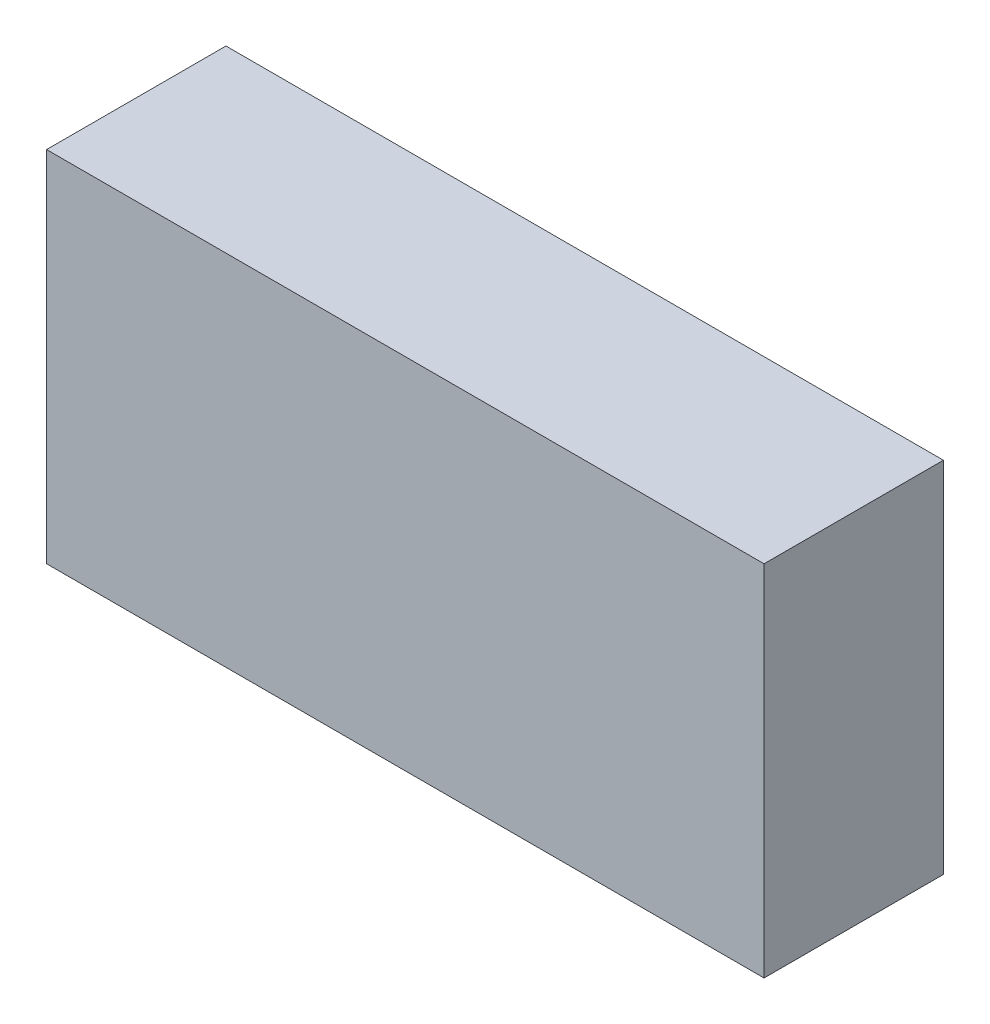
ISO-10303-21;
HEADER;
FILE_DESCRIPTION(('STEP AP214'),'2;1');
FILE_NAME('part.step','',(''),(''),'','','');
FILE_SCHEMA(('AUTOMOTIVE_DESIGN { 1 0 10303 214 1 1 1 1 }'));
ENDSEC;
DATA;
#1=APPLICATION_CONTEXT('core data for automotive mechanical design processes');
#2=APPLICATION_PROTOCOL_DEFINITION('international standard','automotive_design',2000,#1);
#3=PRODUCT_CONTEXT('',#1,'mechanical');
#4=PRODUCT('Part','Part','',(#3));
#5=PRODUCT_RELATED_PRODUCT_CATEGORY('part','',(#4));
#6=PRODUCT_DEFINITION_FORMATION('','',#4);
#7=PRODUCT_DEFINITION_CONTEXT('part definition',#1,'design');
#8=PRODUCT_DEFINITION('design','',#6,#7);
#9=PRODUCT_DEFINITION_SHAPE('','',#8);
#10=(LENGTH_UNIT() NAMED_UNIT(*) SI_UNIT(.MILLI.,.METRE.));
#11=(NAMED_UNIT(*) PLANE_ANGLE_UNIT() SI_UNIT($,.RADIAN.));
#12=(NAMED_UNIT(*) SI_UNIT($,.STERADIAN.) SOLID_ANGLE_UNIT());
#13=UNCERTAINTY_MEASURE_WITH_UNIT(LENGTH_MEASURE(1.E-05),#10,'distance_accuracy_value','');
#14=(GEOMETRIC_REPRESENTATION_CONTEXT(3) GLOBAL_UNCERTAINTY_ASSIGNED_CONTEXT((#13)) GLOBAL_UNIT_ASSIGNED_CONTEXT((#10,
#11,#12)) REPRESENTATION_CONTEXT('',''));
#15=CARTESIAN_POINT('',(0.,0.,0.));
#16=DIRECTION('',(0.,0.,1.));
#17=DIRECTION('',(1.,0.,0.));
#18=AXIS2_PLACEMENT_3D('',#15,#16,#17);
#19=CARTESIAN_POINT('',(0.,0.,50.8));
#20=DIRECTION('',(1.,0.,0.));
#21=DIRECTION('',(0.,0.,-1.));
#22=AXIS2_PLACEMENT_3D('',#19,#20,#21);
#23=PLANE('',#22);
#24=DIRECTION('',(0.,-1.,0.));
#25=VECTOR('',#24,1.);
#26=CARTESIAN_POINT('',(0.,0.,0.));
#27=LINE('',#26,#25);
#28=CARTESIAN_POINT('',(0.,101.6,0.));
#29=VERTEX_POINT('',#28);
#30=CARTESIAN_POINT('',(0.,0.,0.));
#31=VERTEX_POINT('',#30);
#32=EDGE_CURVE('E81',#29,#31,#27,.T.);
#33=ORIENTED_EDGE('',*,*,#32,.T.);
#34=DIRECTION('',(0.,0.,-1.));
#35=VECTOR('',#34,1.);
#36=CARTESIAN_POINT('',(0.,0.,50.8));
#37=LINE('',#36,#35);
#38=CARTESIAN_POINT('',(0.,0.,50.8));
#39=VERTEX_POINT('',#38);
#40=EDGE_CURVE('E11',#39,#31,#37,.T.);
#41=ORIENTED_EDGE('',*,*,#40,.F.);
#42=DIRECTION('',(0.,-1.,0.));
#43=VECTOR('',#42,1.);
#44=CARTESIAN_POINT('',(0.,0.,50.8));
#45=LINE('',#44,#43);
#46=CARTESIAN_POINT('',(0.,101.6,50.8));
#47=VERTEX_POINT('',#46);
#48=EDGE_CURVE('E99',#47,#39,#45,.T.);
#49=ORIENTED_EDGE('',*,*,#48,.F.);
#50=DIRECTION('',(0.,0.,-1.));
#51=VECTOR('',#50,1.);
#52=CARTESIAN_POINT('',(0.,101.6,50.8));
#53=LINE('',#52,#51);
#54=EDGE_CURVE('E93',#47,#29,#53,.T.);
#55=ORIENTED_EDGE('',*,*,#54,.T.);
#56=EDGE_LOOP('',(#33,#41,#49,#55));
#57=FACE_BOUND('',#56,.T.);
#58=ADVANCED_FACE('F37',(#57),#23,.F.);
#59=CARTESIAN_POINT('',(0.,0.,50.8));
#60=DIRECTION('',(0.,1.,0.));
#61=DIRECTION('',(0.,0.,1.));
#62=AXIS2_PLACEMENT_3D('',#59,#60,#61);
#63=PLANE('',#62);
#64=DIRECTION('',(1.,0.,0.));
#65=VECTOR('',#64,1.);
#66=CARTESIAN_POINT('',(0.,0.,0.));
#67=LINE('',#66,#65);
#68=CARTESIAN_POINT('',(203.2,0.,0.));
#69=VERTEX_POINT('',#68);
#70=EDGE_CURVE('E77',#31,#69,#67,.T.);
#71=ORIENTED_EDGE('',*,*,#70,.T.);
#72=DIRECTION('',(0.,0.,-1.));
#73=VECTOR('',#72,1.);
#74=CARTESIAN_POINT('',(203.2,0.,50.8));
#75=LINE('',#74,#73);
#76=CARTESIAN_POINT('',(203.2,0.,50.8));
#77=VERTEX_POINT('',#76);
#78=EDGE_CURVE('E44',#77,#69,#75,.T.);
#79=ORIENTED_EDGE('',*,*,#78,.F.);
#80=DIRECTION('',(1.,0.,0.));
#81=VECTOR('',#80,1.);
#82=CARTESIAN_POINT('',(0.,0.,50.8));
#83=LINE('',#82,#81);
#84=EDGE_CURVE('E89',#39,#77,#83,.T.);
#85=ORIENTED_EDGE('',*,*,#84,.F.);
#86=ORIENTED_EDGE('',*,*,#40,.T.);
#87=EDGE_LOOP('',(#71,#79,#85,#86));
#88=FACE_BOUND('',#87,.T.);
#89=ADVANCED_FACE('F88',(#88),#63,.F.);
#90=CARTESIAN_POINT('',(203.2,0.,50.8));
#91=DIRECTION('',(-1.,0.,0.));
#92=DIRECTION('',(0.,0.,1.));
#93=AXIS2_PLACEMENT_3D('',#90,#91,#92);
#94=PLANE('',#93);
#95=DIRECTION('',(0.,1.,0.));
#96=VECTOR('',#95,1.);
#97=CARTESIAN_POINT('',(203.2,0.,0.));
#98=LINE('',#97,#96);
#99=CARTESIAN_POINT('',(203.2,101.6,0.));
#100=VERTEX_POINT('',#99);
#101=EDGE_CURVE('E82',#69,#100,#98,.T.);
#102=ORIENTED_EDGE('',*,*,#101,.T.);
#103=DIRECTION('',(0.,0.,-1.));
#104=VECTOR('',#103,1.);
#105=CARTESIAN_POINT('',(203.2,101.6,50.8));
#106=LINE('',#105,#104);
#107=CARTESIAN_POINT('',(203.2,101.6,50.8));
#108=VERTEX_POINT('',#107);
#109=EDGE_CURVE('E105',#108,#100,#106,.T.);
#110=ORIENTED_EDGE('',*,*,#109,.F.);
#111=DIRECTION('',(0.,1.,0.));
#112=VECTOR('',#111,1.);
#113=CARTESIAN_POINT('',(203.2,0.,50.8));
#114=LINE('',#113,#112);
#115=EDGE_CURVE('E56',#77,#108,#114,.T.);
#116=ORIENTED_EDGE('',*,*,#115,.F.);
#117=ORIENTED_EDGE('',*,*,#78,.T.);
#118=EDGE_LOOP('',(#102,#110,#116,#117));
#119=FACE_BOUND('',#118,.T.);
#120=ADVANCED_FACE('F108',(#119),#94,.F.);
#121=CARTESIAN_POINT('',(0.,101.6,50.8));
#122=DIRECTION('',(0.,-1.,0.));
#123=DIRECTION('',(0.,0.,-1.));
#124=AXIS2_PLACEMENT_3D('',#121,#122,#123);
#125=PLANE('',#124);
#126=DIRECTION('',(-1.,0.,0.));
#127=VECTOR('',#126,1.);
#128=CARTESIAN_POINT('',(0.,101.6,0.));
#129=LINE('',#128,#127);
#130=EDGE_CURVE('E97',#100,#29,#129,.T.);
#131=ORIENTED_EDGE('',*,*,#130,.T.);
#132=ORIENTED_EDGE('',*,*,#54,.F.);
#133=DIRECTION('',(-1.,0.,0.));
#134=VECTOR('',#133,1.);
#135=CARTESIAN_POINT('',(0.,101.6,50.8));
#136=LINE('',#135,#134);
#137=EDGE_CURVE('E51',#108,#47,#136,.T.);
#138=ORIENTED_EDGE('',*,*,#137,.F.);
#139=ORIENTED_EDGE('',*,*,#109,.T.);
#140=EDGE_LOOP('',(#131,#132,#138,#139));
#141=FACE_BOUND('',#140,.T.);
#142=ADVANCED_FACE('F110',(#141),#125,.F.);
#143=CARTESIAN_POINT('',(0.,101.6,50.8));
#144=DIRECTION('',(0.,0.,-1.));
#145=DIRECTION('',(-1.,0.,0.));
#146=AXIS2_PLACEMENT_3D('',#143,#144,#145);
#147=PLANE('',#146);
#148=ORIENTED_EDGE('',*,*,#48,.T.);
#149=ORIENTED_EDGE('',*,*,#84,.T.);
#150=ORIENTED_EDGE('',*,*,#115,.T.);
#151=ORIENTED_EDGE('',*,*,#137,.T.);
#152=EDGE_LOOP('',(#148,#149,#150,#151));
#153=FACE_BOUND('',#152,.T.);
#154=ADVANCED_FACE('F111',(#153),#147,.F.);
#155=CARTESIAN_POINT('',(0.,101.6,0.));
#156=DIRECTION('',(0.,0.,-1.));
#157=DIRECTION('',(-1.,0.,0.));
#158=AXIS2_PLACEMENT_3D('',#155,#156,#157);
#159=PLANE('',#158);
#160=ORIENTED_EDGE('',*,*,#32,.F.);
#161=ORIENTED_EDGE('',*,*,#130,.F.);
#162=ORIENTED_EDGE('',*,*,#101,.F.);
#163=ORIENTED_EDGE('',*,*,#70,.F.);
#164=EDGE_LOOP('',(#160,#161,#162,#163));
#165=FACE_BOUND('',#164,.T.);
#166=ADVANCED_FACE('F78',(#165),#159,.T.);
#167=CLOSED_SHELL('',(#58,#89,#120,#142,#154,#166));
#168=MANIFOLD_SOLID_BREP('B2',#167);
#169=ADVANCED_BREP_SHAPE_REPRESENTATION('',(#18,#168),#14);
#170=SHAPE_DEFINITION_REPRESENTATION(#9,#169);
ENDSEC;
END-ISO-10303-21;
